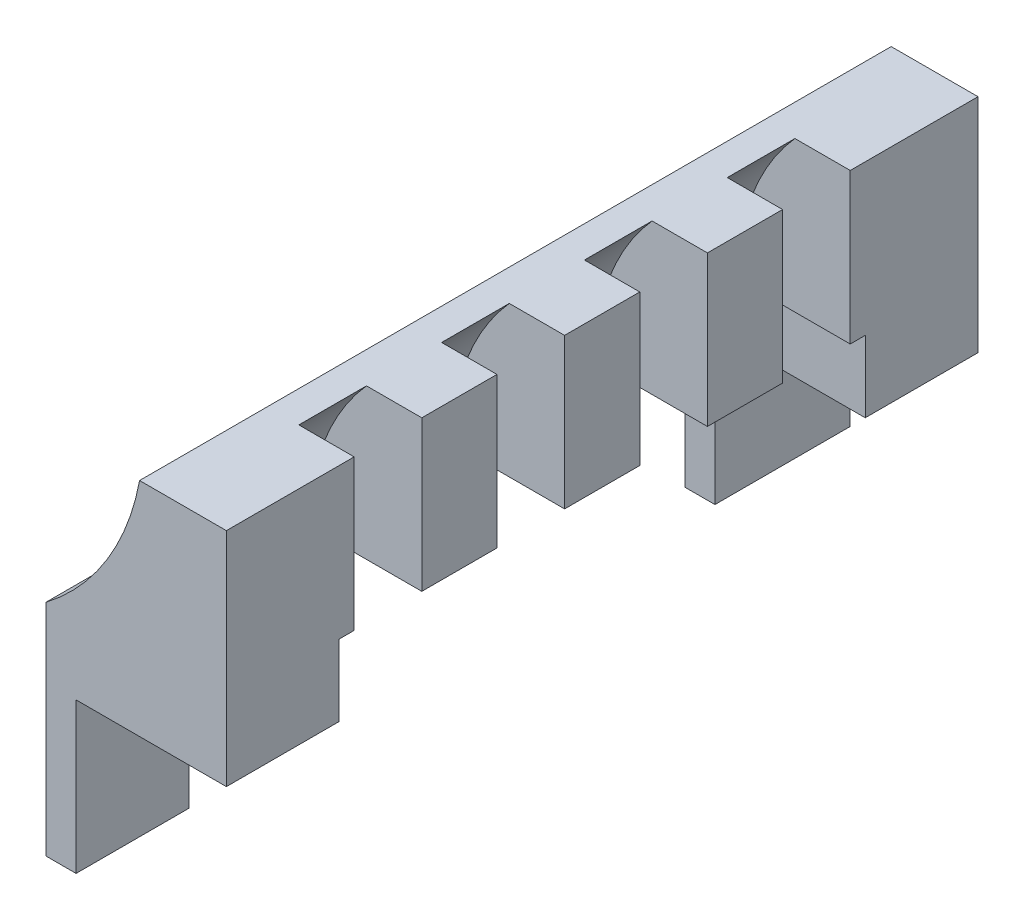
ISO-10303-21;
HEADER;
FILE_DESCRIPTION(('STEP AP214'),'2;1');
FILE_NAME('part.step','',(''),(''),'','','');
FILE_SCHEMA(('AUTOMOTIVE_DESIGN { 1 0 10303 214 1 1 1 1 }'));
ENDSEC;
DATA;
#1=APPLICATION_CONTEXT('core data for automotive mechanical design processes');
#2=APPLICATION_PROTOCOL_DEFINITION('international standard','automotive_design',2000,#1);
#3=PRODUCT_CONTEXT('',#1,'mechanical');
#4=PRODUCT('Part','Part','',(#3));
#5=PRODUCT_RELATED_PRODUCT_CATEGORY('part','',(#4));
#6=PRODUCT_DEFINITION_FORMATION('','',#4);
#7=PRODUCT_DEFINITION_CONTEXT('part definition',#1,'design');
#8=PRODUCT_DEFINITION('design','',#6,#7);
#9=PRODUCT_DEFINITION_SHAPE('','',#8);
#10=(LENGTH_UNIT() NAMED_UNIT(*) SI_UNIT(.MILLI.,.METRE.));
#11=(NAMED_UNIT(*) PLANE_ANGLE_UNIT() SI_UNIT($,.RADIAN.));
#12=(NAMED_UNIT(*) SI_UNIT($,.STERADIAN.) SOLID_ANGLE_UNIT());
#13=UNCERTAINTY_MEASURE_WITH_UNIT(LENGTH_MEASURE(1.E-05),#10,'distance_accuracy_value','');
#14=(GEOMETRIC_REPRESENTATION_CONTEXT(3) GLOBAL_UNCERTAINTY_ASSIGNED_CONTEXT((#13)) GLOBAL_UNIT_ASSIGNED_CONTEXT((#10,
#11,#12)) REPRESENTATION_CONTEXT('',''));
#15=CARTESIAN_POINT('',(0.,0.,0.));
#16=DIRECTION('',(0.,0.,1.));
#17=DIRECTION('',(1.,0.,0.));
#18=AXIS2_PLACEMENT_3D('',#15,#16,#17);
#19=CARTESIAN_POINT('',(-22.,40.75,-50.));
#20=DIRECTION('',(0.,0.,1.));
#21=DIRECTION('',(1.,0.,0.));
#22=AXIS2_PLACEMENT_3D('',#19,#20,#21);
#23=PLANE('',#22);
#24=DIRECTION('',(0.,-1.,0.));
#25=VECTOR('',#24,1.);
#26=CARTESIAN_POINT('',(12.,0.250000000000003,-50.));
#27=LINE('',#26,#25);
#28=CARTESIAN_POINT('',(12.,14.5011905031866,-50.));
#29=VERTEX_POINT('',#28);
#30=CARTESIAN_POINT('',(12.,5.25,-50.));
#31=VERTEX_POINT('',#30);
#32=EDGE_CURVE('E292',#29,#31,#27,.T.);
#33=ORIENTED_EDGE('',*,*,#32,.F.);
#34=DIRECTION('',(1.,0.,0.));
#35=VECTOR('',#34,1.);
#36=CARTESIAN_POINT('',(12.,14.5011905031866,-50.));
#37=LINE('',#36,#35);
#38=CARTESIAN_POINT('',(-2.00000000000001,14.5011905031866,-50.));
#39=VERTEX_POINT('',#38);
#40=EDGE_CURVE('E302',#39,#29,#37,.T.);
#41=ORIENTED_EDGE('',*,*,#40,.F.);
#42=CARTESIAN_POINT('',(-22.,40.75,-50.));
#43=DIRECTION('',(0.,0.,-1.));
#44=DIRECTION('',(1.,0.,0.));
#45=AXIS2_PLACEMENT_3D('',#42,#43,#44);
#46=CIRCLE('',#45,33.);
#47=CARTESIAN_POINT('',(10.4499614791759,34.75,-50.));
#48=VERTEX_POINT('',#47);
#49=EDGE_CURVE('E461',#48,#39,#46,.T.);
#50=ORIENTED_EDGE('',*,*,#49,.F.);
#51=DIRECTION('',(-1.,0.,0.));
#52=VECTOR('',#51,1.);
#53=CARTESIAN_POINT('',(10.4499614791759,34.75,-50.));
#54=LINE('',#53,#52);
#55=CARTESIAN_POINT('',(22.,34.75,-50.));
#56=VERTEX_POINT('',#55);
#57=EDGE_CURVE('E459',#56,#48,#54,.T.);
#58=ORIENTED_EDGE('',*,*,#57,.F.);
#59=DIRECTION('',(0.,1.,0.));
#60=VECTOR('',#59,1.);
#61=CARTESIAN_POINT('',(22.,14.75,-50.));
#62=LINE('',#61,#60);
#63=CARTESIAN_POINT('',(22.,5.25,-50.));
#64=VERTEX_POINT('',#63);
#65=EDGE_CURVE('E457',#64,#56,#62,.T.);
#66=ORIENTED_EDGE('',*,*,#65,.F.);
#67=DIRECTION('',(1.,0.,0.));
#68=VECTOR('',#67,1.);
#69=CARTESIAN_POINT('',(22.,5.25,-50.));
#70=LINE('',#69,#68);
#71=EDGE_CURVE('E64',#31,#64,#70,.T.);
#72=ORIENTED_EDGE('',*,*,#71,.F.);
#73=EDGE_LOOP('',(#33,#41,#50,#58,#66,#72));
#74=FACE_BOUND('',#73,.T.);
#75=ADVANCED_FACE('F41',(#74),#23,.F.);
#76=CARTESIAN_POINT('',(22.,34.75,-50.));
#77=DIRECTION('',(1.,0.,0.));
#78=DIRECTION('',(0.,0.,-1.));
#79=AXIS2_PLACEMENT_3D('',#76,#77,#78);
#80=PLANE('',#79);
#81=DIRECTION('',(0.,1.,0.));
#82=VECTOR('',#81,1.);
#83=CARTESIAN_POINT('',(22.,-2.74285568453605,24.));
#84=LINE('',#83,#82);
#85=CARTESIAN_POINT('',(22.,14.75,24.));
#86=VERTEX_POINT('',#85);
#87=CARTESIAN_POINT('',(22.,34.75,24.));
#88=VERTEX_POINT('',#87);
#89=EDGE_CURVE('E344',#86,#88,#84,.T.);
#90=ORIENTED_EDGE('',*,*,#89,.F.);
#91=DIRECTION('',(0.,0.,1.));
#92=VECTOR('',#91,1.);
#93=CARTESIAN_POINT('',(22.,14.75,35.));
#94=LINE('',#93,#92);
#95=CARTESIAN_POINT('',(22.,14.75,14.));
#96=VERTEX_POINT('',#95);
#97=EDGE_CURVE('E521',#96,#86,#94,.T.);
#98=ORIENTED_EDGE('',*,*,#97,.F.);
#99=DIRECTION('',(0.,1.,0.));
#100=VECTOR('',#99,1.);
#101=CARTESIAN_POINT('',(21.9999999999999,-2.74285568453605,14.));
#102=LINE('',#101,#100);
#103=CARTESIAN_POINT('',(21.9999999999999,34.75,14.));
#104=VERTEX_POINT('',#103);
#105=EDGE_CURVE('E363',#96,#104,#102,.T.);
#106=ORIENTED_EDGE('',*,*,#105,.T.);
#107=DIRECTION('',(0.,0.,1.));
#108=VECTOR('',#107,1.);
#109=CARTESIAN_POINT('',(22.,34.75,-50.));
#110=LINE('',#109,#108);
#111=EDGE_CURVE('E534',#104,#88,#110,.T.);
#112=ORIENTED_EDGE('',*,*,#111,.T.);
#113=EDGE_LOOP('',(#90,#98,#106,#112));
#114=FACE_BOUND('',#113,.T.);
#115=ADVANCED_FACE('F577',(#114),#80,.T.);
#116=DIRECTION('',(0.,1.,0.));
#117=VECTOR('',#116,1.);
#118=CARTESIAN_POINT('',(21.9999999999999,-2.74285568453605,4.99999999999999));
#119=LINE('',#118,#117);
#120=CARTESIAN_POINT('',(21.9999999999999,14.75,4.99999999999999));
#121=VERTEX_POINT('',#120);
#122=CARTESIAN_POINT('',(21.9999999999999,34.75,4.99999999999999));
#123=VERTEX_POINT('',#122);
#124=EDGE_CURVE('E367',#121,#123,#119,.T.);
#125=ORIENTED_EDGE('',*,*,#124,.F.);
#126=CARTESIAN_POINT('',(22.,14.75,-5.));
#127=VERTEX_POINT('',#126);
#128=EDGE_CURVE('E570',#127,#121,#94,.T.);
#129=ORIENTED_EDGE('',*,*,#128,.F.);
#130=DIRECTION('',(0.,1.,0.));
#131=VECTOR('',#130,1.);
#132=CARTESIAN_POINT('',(21.9999999999999,-2.74285568453605,-4.99999999999999));
#133=LINE('',#132,#131);
#134=CARTESIAN_POINT('',(21.9999999999999,34.75,-4.99999999999999));
#135=VERTEX_POINT('',#134);
#136=EDGE_CURVE('E379',#127,#135,#133,.T.);
#137=ORIENTED_EDGE('',*,*,#136,.T.);
#138=EDGE_CURVE('E536',#135,#123,#110,.T.);
#139=ORIENTED_EDGE('',*,*,#138,.T.);
#140=EDGE_LOOP('',(#125,#129,#137,#139));
#141=FACE_BOUND('',#140,.T.);
#142=ADVANCED_FACE('F607',(#141),#80,.T.);
#143=DIRECTION('',(0.,1.,0.));
#144=VECTOR('',#143,1.);
#145=CARTESIAN_POINT('',(21.9999999999999,-2.74285568453605,-14.));
#146=LINE('',#145,#144);
#147=CARTESIAN_POINT('',(21.9999999999999,14.75,-14.));
#148=VERTEX_POINT('',#147);
#149=CARTESIAN_POINT('',(21.9999999999999,34.75,-14.));
#150=VERTEX_POINT('',#149);
#151=EDGE_CURVE('E383',#148,#150,#146,.T.);
#152=ORIENTED_EDGE('',*,*,#151,.F.);
#153=CARTESIAN_POINT('',(22.,14.75,-24.));
#154=VERTEX_POINT('',#153);
#155=EDGE_CURVE('E414',#154,#148,#94,.T.);
#156=ORIENTED_EDGE('',*,*,#155,.F.);
#157=DIRECTION('',(0.,1.,0.));
#158=VECTOR('',#157,1.);
#159=CARTESIAN_POINT('',(22.,-2.74285568453605,-24.));
#160=LINE('',#159,#158);
#161=CARTESIAN_POINT('',(22.,34.75,-24.));
#162=VERTEX_POINT('',#161);
#163=EDGE_CURVE('E393',#154,#162,#160,.T.);
#164=ORIENTED_EDGE('',*,*,#163,.T.);
#165=EDGE_CURVE('E476',#162,#150,#110,.T.);
#166=ORIENTED_EDGE('',*,*,#165,.T.);
#167=EDGE_LOOP('',(#152,#156,#164,#166));
#168=FACE_BOUND('',#167,.T.);
#169=ADVANCED_FACE('F548',(#168),#80,.T.);
#170=DIRECTION('',(0.,1.,0.));
#171=VECTOR('',#170,1.);
#172=CARTESIAN_POINT('',(22.,-2.74285568453605,-33.));
#173=LINE('',#172,#171);
#174=CARTESIAN_POINT('',(22.,14.75,-33.));
#175=VERTEX_POINT('',#174);
#176=CARTESIAN_POINT('',(22.,34.75,-33.));
#177=VERTEX_POINT('',#176);
#178=EDGE_CURVE('E397',#175,#177,#173,.T.);
#179=ORIENTED_EDGE('',*,*,#178,.F.);
#180=CARTESIAN_POINT('',(22.,14.75,-35.));
#181=VERTEX_POINT('',#180);
#182=EDGE_CURVE('E410',#181,#175,#94,.T.);
#183=ORIENTED_EDGE('',*,*,#182,.F.);
#184=DIRECTION('',(0.,1.,0.));
#185=VECTOR('',#184,1.);
#186=CARTESIAN_POINT('',(22.,-14.75,-35.));
#187=LINE('',#186,#185);
#188=CARTESIAN_POINT('',(22.,5.25,-35.));
#189=VERTEX_POINT('',#188);
#190=EDGE_CURVE('E406',#189,#181,#187,.T.);
#191=ORIENTED_EDGE('',*,*,#190,.F.);
#192=DIRECTION('',(0.,0.,1.));
#193=VECTOR('',#192,1.);
#194=CARTESIAN_POINT('',(22.,5.25,-50.));
#195=LINE('',#194,#193);
#196=EDGE_CURVE('E478',#64,#189,#195,.T.);
#197=ORIENTED_EDGE('',*,*,#196,.F.);
#198=ORIENTED_EDGE('',*,*,#65,.T.);
#199=EDGE_CURVE('E473',#56,#177,#110,.T.);
#200=ORIENTED_EDGE('',*,*,#199,.T.);
#201=EDGE_LOOP('',(#179,#183,#191,#197,#198,#200));
#202=FACE_BOUND('',#201,.T.);
#203=ADVANCED_FACE('F618',(#202),#80,.T.);
#204=CARTESIAN_POINT('',(-2.,-14.75,-50.));
#205=DIRECTION('',(-1.,0.,0.));
#206=DIRECTION('',(0.,-1.,0.));
#207=AXIS2_PLACEMENT_3D('',#204,#205,#206);
#208=PLANE('',#207);
#209=DIRECTION('',(0.,1.,0.));
#210=VECTOR('',#209,1.);
#211=CARTESIAN_POINT('',(-2.,-14.75,35.));
#212=LINE('',#211,#210);
#213=CARTESIAN_POINT('',(-2.,-14.75,35.));
#214=VERTEX_POINT('',#213);
#215=CARTESIAN_POINT('',(-2.00000000000001,14.5011905031866,35.));
#216=VERTEX_POINT('',#215);
#217=EDGE_CURVE('E431',#214,#216,#212,.T.);
#218=ORIENTED_EDGE('',*,*,#217,.F.);
#219=DIRECTION('',(0.,0.,1.));
#220=VECTOR('',#219,1.);
#221=CARTESIAN_POINT('',(-2.,-14.75,-50.));
#222=LINE('',#221,#220);
#223=CARTESIAN_POINT('',(-2.,-14.75,50.));
#224=VERTEX_POINT('',#223);
#225=EDGE_CURVE('E464',#214,#224,#222,.T.);
#226=ORIENTED_EDGE('',*,*,#225,.T.);
#227=DIRECTION('',(0.,-1.,0.));
#228=VECTOR('',#227,1.);
#229=CARTESIAN_POINT('',(-2.,-14.75,50.));
#230=LINE('',#229,#228);
#231=CARTESIAN_POINT('',(-2.00000000000001,14.5011905031866,50.));
#232=VERTEX_POINT('',#231);
#233=EDGE_CURVE('E435',#232,#224,#230,.T.);
#234=ORIENTED_EDGE('',*,*,#233,.F.);
#235=DIRECTION('',(0.,0.,1.));
#236=VECTOR('',#235,1.);
#237=CARTESIAN_POINT('',(-2.00000000000001,14.5011905031866,-50.));
#238=LINE('',#237,#236);
#239=EDGE_CURVE('E469',#216,#232,#238,.T.);
#240=ORIENTED_EDGE('',*,*,#239,.F.);
#241=EDGE_LOOP('',(#218,#226,#234,#240));
#242=FACE_BOUND('',#241,.T.);
#243=ADVANCED_FACE('F496',(#242),#208,.T.);
#244=CARTESIAN_POINT('',(22.,5.25,-50.));
#245=DIRECTION('',(0.,-1.,0.));
#246=DIRECTION('',(1.,0.,0.));
#247=AXIS2_PLACEMENT_3D('',#244,#245,#246);
#248=PLANE('',#247);
#249=DIRECTION('',(-1.,0.,0.));
#250=VECTOR('',#249,1.);
#251=CARTESIAN_POINT('',(22.,5.25,35.));
#252=LINE('',#251,#250);
#253=CARTESIAN_POINT('',(22.,5.25,35.));
#254=VERTEX_POINT('',#253);
#255=CARTESIAN_POINT('',(2.,5.25,35.));
#256=VERTEX_POINT('',#255);
#257=EDGE_CURVE('E427',#254,#256,#252,.T.);
#258=ORIENTED_EDGE('',*,*,#257,.F.);
#259=CARTESIAN_POINT('',(22.,5.25,50.));
#260=VERTEX_POINT('',#259);
#261=EDGE_CURVE('E481',#254,#260,#195,.T.);
#262=ORIENTED_EDGE('',*,*,#261,.T.);
#263=DIRECTION('',(1.,0.,0.));
#264=VECTOR('',#263,1.);
#265=CARTESIAN_POINT('',(22.,5.25,50.));
#266=LINE('',#265,#264);
#267=CARTESIAN_POINT('',(2.,5.25,50.));
#268=VERTEX_POINT('',#267);
#269=EDGE_CURVE('E444',#268,#260,#266,.T.);
#270=ORIENTED_EDGE('',*,*,#269,.F.);
#271=DIRECTION('',(0.,0.,1.));
#272=VECTOR('',#271,1.);
#273=CARTESIAN_POINT('',(2.,5.25,-50.));
#274=LINE('',#273,#272);
#275=EDGE_CURVE('E274',#256,#268,#274,.T.);
#276=ORIENTED_EDGE('',*,*,#275,.F.);
#277=EDGE_LOOP('',(#258,#262,#270,#276));
#278=FACE_BOUND('',#277,.T.);
#279=ADVANCED_FACE('F528',(#278),#248,.T.);
#280=CARTESIAN_POINT('',(2.,-14.75,-50.));
#281=DIRECTION('',(1.,0.,0.));
#282=DIRECTION('',(0.,0.,-1.));
#283=AXIS2_PLACEMENT_3D('',#280,#281,#282);
#284=PLANE('',#283);
#285=DIRECTION('',(0.,-1.,0.));
#286=VECTOR('',#285,1.);
#287=CARTESIAN_POINT('',(2.,-14.75,35.));
#288=LINE('',#287,#286);
#289=CARTESIAN_POINT('',(2.,-14.75,35.));
#290=VERTEX_POINT('',#289);
#291=EDGE_CURVE('E425',#256,#290,#288,.T.);
#292=ORIENTED_EDGE('',*,*,#291,.F.);
#293=ORIENTED_EDGE('',*,*,#275,.T.);
#294=DIRECTION('',(0.,1.,0.));
#295=VECTOR('',#294,1.);
#296=CARTESIAN_POINT('',(2.,-14.75,50.));
#297=LINE('',#296,#295);
#298=CARTESIAN_POINT('',(2.,-14.75,50.));
#299=VERTEX_POINT('',#298);
#300=EDGE_CURVE('E441',#299,#268,#297,.T.);
#301=ORIENTED_EDGE('',*,*,#300,.F.);
#302=DIRECTION('',(0.,0.,1.));
#303=VECTOR('',#302,1.);
#304=CARTESIAN_POINT('',(2.,-14.75,-50.));
#305=LINE('',#304,#303);
#306=EDGE_CURVE('E275',#290,#299,#305,.T.);
#307=ORIENTED_EDGE('',*,*,#306,.F.);
#308=EDGE_LOOP('',(#292,#293,#301,#307));
#309=FACE_BOUND('',#308,.T.);
#310=ADVANCED_FACE('F531',(#309),#284,.T.);
#311=CARTESIAN_POINT('',(-2.,-14.75,-50.));
#312=DIRECTION('',(0.,-1.,0.));
#313=DIRECTION('',(0.,0.,-1.));
#314=AXIS2_PLACEMENT_3D('',#311,#312,#313);
#315=PLANE('',#314);
#316=DIRECTION('',(-1.,0.,0.));
#317=VECTOR('',#316,1.);
#318=CARTESIAN_POINT('',(-2.,-14.75,35.));
#319=LINE('',#318,#317);
#320=EDGE_CURVE('E49',#290,#214,#319,.T.);
#321=ORIENTED_EDGE('',*,*,#320,.F.);
#322=ORIENTED_EDGE('',*,*,#306,.T.);
#323=DIRECTION('',(1.,0.,0.));
#324=VECTOR('',#323,1.);
#325=CARTESIAN_POINT('',(-2.,-14.75,50.));
#326=LINE('',#325,#324);
#327=EDGE_CURVE('E438',#224,#299,#326,.T.);
#328=ORIENTED_EDGE('',*,*,#327,.F.);
#329=ORIENTED_EDGE('',*,*,#225,.F.);
#330=EDGE_LOOP('',(#321,#322,#328,#329));
#331=FACE_BOUND('',#330,.T.);
#332=ADVANCED_FACE('F500',(#331),#315,.T.);
#333=DIRECTION('',(0.,-1.,0.));
#334=VECTOR('',#333,1.);
#335=CARTESIAN_POINT('',(-2.,-14.75,-35.));
#336=LINE('',#335,#334);
#337=CARTESIAN_POINT('',(-2.00000000000001,14.5011905031866,-35.));
#338=VERTEX_POINT('',#337);
#339=CARTESIAN_POINT('',(-2.,-14.75,-35.));
#340=VERTEX_POINT('',#339);
#341=EDGE_CURVE('E423',#338,#340,#336,.T.);
#342=ORIENTED_EDGE('',*,*,#341,.F.);
#343=EDGE_CURVE('E465',#39,#338,#238,.T.);
#344=ORIENTED_EDGE('',*,*,#343,.F.);
#345=DIRECTION('',(0.,0.,1.));
#346=VECTOR('',#345,1.);
#347=CARTESIAN_POINT('',(-2.,14.5011905031866,-53.));
#348=LINE('',#347,#346);
#349=CARTESIAN_POINT('',(-2.,14.5011905031866,-53.));
#350=VERTEX_POINT('',#349);
#351=EDGE_CURVE('E315',#350,#39,#348,.T.);
#352=ORIENTED_EDGE('',*,*,#351,.F.);
#353=DIRECTION('',(0.,1.,0.));
#354=VECTOR('',#353,1.);
#355=CARTESIAN_POINT('',(-2.,-14.75,-53.));
#356=LINE('',#355,#354);
#357=CARTESIAN_POINT('',(-2.,-14.75,-53.));
#358=VERTEX_POINT('',#357);
#359=EDGE_CURVE('E284',#358,#350,#356,.T.);
#360=ORIENTED_EDGE('',*,*,#359,.F.);
#361=EDGE_CURVE('E281',#358,#340,#222,.T.);
#362=ORIENTED_EDGE('',*,*,#361,.T.);
#363=EDGE_LOOP('',(#342,#344,#352,#360,#362));
#364=FACE_BOUND('',#363,.T.);
#365=ADVANCED_FACE('F43',(#364),#208,.T.);
#366=CARTESIAN_POINT('',(-22.,40.75,-50.));
#367=DIRECTION('',(0.,0.,1.));
#368=DIRECTION('',(1.,0.,0.));
#369=AXIS2_PLACEMENT_3D('',#366,#367,#368);
#370=CYLINDRICAL_SURFACE('',#369,33.);
#371=ORIENTED_EDGE('',*,*,#239,.T.);
#372=CARTESIAN_POINT('',(-22.,40.75,50.));
#373=DIRECTION('',(0.,0.,-1.));
#374=DIRECTION('',(1.,0.,0.));
#375=AXIS2_PLACEMENT_3D('',#372,#373,#374);
#376=CIRCLE('',#375,33.);
#377=CARTESIAN_POINT('',(10.4499614791759,34.75,50.));
#378=VERTEX_POINT('',#377);
#379=EDGE_CURVE('E452',#378,#232,#376,.T.);
#380=ORIENTED_EDGE('',*,*,#379,.F.);
#381=DIRECTION('',(0.,0.,1.));
#382=VECTOR('',#381,1.);
#383=CARTESIAN_POINT('',(10.4499614791759,34.75,-50.));
#384=LINE('',#383,#382);
#385=EDGE_CURVE('E470',#48,#378,#384,.T.);
#386=ORIENTED_EDGE('',*,*,#385,.F.);
#387=ORIENTED_EDGE('',*,*,#49,.T.);
#388=ORIENTED_EDGE('',*,*,#343,.T.);
#389=CARTESIAN_POINT('',(-22.,40.75,-35.));
#390=DIRECTION('',(0.,0.,-1.));
#391=DIRECTION('',(-1.,0.,0.));
#392=AXIS2_PLACEMENT_3D('',#389,#390,#391);
#393=CIRCLE('',#392,33.);
#394=CARTESIAN_POINT('',(-1.67759856709843,14.75,-35.));
#395=VERTEX_POINT('',#394);
#396=EDGE_CURVE('E421',#395,#338,#393,.T.);
#397=ORIENTED_EDGE('',*,*,#396,.F.);
#398=DIRECTION('',(0.,0.,1.));
#399=VECTOR('',#398,1.);
#400=CARTESIAN_POINT('',(-1.67759856709843,14.75,-50.));
#401=LINE('',#400,#399);
#402=CARTESIAN_POINT('',(-1.67759856709843,14.75,35.));
#403=VERTEX_POINT('',#402);
#404=EDGE_CURVE('E433',#403,#395,#401,.F.);
#405=ORIENTED_EDGE('',*,*,#404,.F.);
#406=CARTESIAN_POINT('',(-22.,40.75,35.));
#407=DIRECTION('',(0.,0.,1.));
#408=DIRECTION('',(1.,0.,0.));
#409=AXIS2_PLACEMENT_3D('',#406,#407,#408);
#410=CIRCLE('',#409,33.);
#411=EDGE_CURVE('E429',#216,#403,#410,.T.);
#412=ORIENTED_EDGE('',*,*,#411,.F.);
#413=EDGE_LOOP('',(#371,#380,#386,#387,#388,#397,#405,#412));
#414=FACE_BOUND('',#413,.T.);
#415=ADVANCED_FACE('F508',(#414),#370,.F.);
#416=CARTESIAN_POINT('',(10.4499614791759,34.75,-50.));
#417=DIRECTION('',(0.,1.,0.));
#418=DIRECTION('',(0.,0.,1.));
#419=AXIS2_PLACEMENT_3D('',#416,#417,#418);
#420=PLANE('',#419);
#421=DIRECTION('',(1.,0.,0.));
#422=VECTOR('',#421,1.);
#423=CARTESIAN_POINT('',(6.99999999999987,34.75,33.));
#424=LINE('',#423,#422);
#425=CARTESIAN_POINT('',(14.6393202250021,34.75,33.));
#426=VERTEX_POINT('',#425);
#427=CARTESIAN_POINT('',(22.,34.75,33.));
#428=VERTEX_POINT('',#427);
#429=EDGE_CURVE('E348',#426,#428,#424,.T.);
#430=ORIENTED_EDGE('',*,*,#429,.F.);
#431=DIRECTION('',(0.,0.,1.));
#432=VECTOR('',#431,1.);
#433=CARTESIAN_POINT('',(14.6393202250021,34.75,-71.4093253863854));
#434=LINE('',#433,#432);
#435=CARTESIAN_POINT('',(14.6393202250021,34.75,24.));
#436=VERTEX_POINT('',#435);
#437=EDGE_CURVE('E318',#436,#426,#434,.T.);
#438=ORIENTED_EDGE('',*,*,#437,.F.);
#439=DIRECTION('',(-1.,0.,0.));
#440=VECTOR('',#439,1.);
#441=CARTESIAN_POINT('',(6.99999999999987,34.75,24.));
#442=LINE('',#441,#440);
#443=EDGE_CURVE('E350',#88,#436,#442,.T.);
#444=ORIENTED_EDGE('',*,*,#443,.F.);
#445=ORIENTED_EDGE('',*,*,#111,.F.);
#446=DIRECTION('',(1.,0.,0.));
#447=VECTOR('',#446,1.);
#448=CARTESIAN_POINT('',(6.99999999999978,34.75,14.));
#449=LINE('',#448,#447);
#450=CARTESIAN_POINT('',(14.6393202250021,34.75,14.));
#451=VERTEX_POINT('',#450);
#452=EDGE_CURVE('E351',#451,#104,#449,.T.);
#453=ORIENTED_EDGE('',*,*,#452,.F.);
#454=CARTESIAN_POINT('',(14.6393202250021,34.75,5.));
#455=VERTEX_POINT('',#454);
#456=EDGE_CURVE('E321',#455,#451,#434,.T.);
#457=ORIENTED_EDGE('',*,*,#456,.F.);
#458=DIRECTION('',(-1.,0.,0.));
#459=VECTOR('',#458,1.);
#460=CARTESIAN_POINT('',(7.00000000000003,34.75,5.));
#461=LINE('',#460,#459);
#462=EDGE_CURVE('E366',#123,#455,#461,.T.);
#463=ORIENTED_EDGE('',*,*,#462,.F.);
#464=ORIENTED_EDGE('',*,*,#138,.F.);
#465=DIRECTION('',(1.,0.,0.));
#466=VECTOR('',#465,1.);
#467=CARTESIAN_POINT('',(7.00000000000002,34.75,-5.));
#468=LINE('',#467,#466);
#469=CARTESIAN_POINT('',(14.6393202250021,34.75,-4.99999999999999));
#470=VERTEX_POINT('',#469);
#471=EDGE_CURVE('E362',#470,#135,#468,.T.);
#472=ORIENTED_EDGE('',*,*,#471,.F.);
#473=CARTESIAN_POINT('',(14.6393202250021,34.75,-14.));
#474=VERTEX_POINT('',#473);
#475=EDGE_CURVE('E556',#474,#470,#434,.T.);
#476=ORIENTED_EDGE('',*,*,#475,.F.);
#477=DIRECTION('',(-1.,0.,0.));
#478=VECTOR('',#477,1.);
#479=CARTESIAN_POINT('',(6.99999999999978,34.75,-14.));
#480=LINE('',#479,#478);
#481=EDGE_CURVE('E382',#150,#474,#480,.T.);
#482=ORIENTED_EDGE('',*,*,#481,.F.);
#483=ORIENTED_EDGE('',*,*,#165,.F.);
#484=DIRECTION('',(1.,0.,0.));
#485=VECTOR('',#484,1.);
#486=CARTESIAN_POINT('',(6.99999999999987,34.75,-24.));
#487=LINE('',#486,#485);
#488=CARTESIAN_POINT('',(14.6393202250021,34.75,-24.));
#489=VERTEX_POINT('',#488);
#490=EDGE_CURVE('E378',#489,#162,#487,.T.);
#491=ORIENTED_EDGE('',*,*,#490,.F.);
#492=CARTESIAN_POINT('',(14.6393202250021,34.75,-33.));
#493=VERTEX_POINT('',#492);
#494=EDGE_CURVE('E322',#493,#489,#434,.T.);
#495=ORIENTED_EDGE('',*,*,#494,.F.);
#496=DIRECTION('',(-1.,0.,0.));
#497=VECTOR('',#496,1.);
#498=CARTESIAN_POINT('',(6.99999999999987,34.75,-33.));
#499=LINE('',#498,#497);
#500=EDGE_CURVE('E396',#177,#493,#499,.T.);
#501=ORIENTED_EDGE('',*,*,#500,.F.);
#502=ORIENTED_EDGE('',*,*,#199,.F.);
#503=ORIENTED_EDGE('',*,*,#57,.T.);
#504=ORIENTED_EDGE('',*,*,#385,.T.);
#505=DIRECTION('',(-1.,0.,0.));
#506=VECTOR('',#505,1.);
#507=CARTESIAN_POINT('',(10.4499614791759,34.75,50.));
#508=LINE('',#507,#506);
#509=CARTESIAN_POINT('',(22.,34.75,50.));
#510=VERTEX_POINT('',#509);
#511=EDGE_CURVE('E450',#510,#378,#508,.T.);
#512=ORIENTED_EDGE('',*,*,#511,.F.);
#513=EDGE_CURVE('E477',#428,#510,#110,.T.);
#514=ORIENTED_EDGE('',*,*,#513,.F.);
#515=EDGE_LOOP('',(#430,#438,#444,#445,#453,#457,#463,#464,#472,#476,#482,#483,#491,#495,#501,
#502,#503,#504,#512,#514));
#516=FACE_BOUND('',#515,.T.);
#517=ADVANCED_FACE('F552',(#516),#420,.T.);
#518=DIRECTION('',(0.,1.,0.));
#519=VECTOR('',#518,1.);
#520=CARTESIAN_POINT('',(22.,-2.74285568453605,33.));
#521=LINE('',#520,#519);
#522=CARTESIAN_POINT('',(22.,14.75,33.));
#523=VERTEX_POINT('',#522);
#524=EDGE_CURVE('E353',#523,#428,#521,.T.);
#525=ORIENTED_EDGE('',*,*,#524,.T.);
#526=ORIENTED_EDGE('',*,*,#513,.T.);
#527=DIRECTION('',(0.,1.,0.));
#528=VECTOR('',#527,1.);
#529=CARTESIAN_POINT('',(22.,14.75,50.));
#530=LINE('',#529,#528);
#531=EDGE_CURVE('E447',#260,#510,#530,.T.);
#532=ORIENTED_EDGE('',*,*,#531,.F.);
#533=ORIENTED_EDGE('',*,*,#261,.F.);
#534=DIRECTION('',(0.,-1.,0.));
#535=VECTOR('',#534,1.);
#536=CARTESIAN_POINT('',(22.,-14.75,35.));
#537=LINE('',#536,#535);
#538=CARTESIAN_POINT('',(22.,14.75,35.));
#539=VERTEX_POINT('',#538);
#540=EDGE_CURVE('E358',#539,#254,#537,.T.);
#541=ORIENTED_EDGE('',*,*,#540,.F.);
#542=EDGE_CURVE('E409',#523,#539,#94,.T.);
#543=ORIENTED_EDGE('',*,*,#542,.F.);
#544=EDGE_LOOP('',(#525,#526,#532,#533,#541,#543));
#545=FACE_BOUND('',#544,.T.);
#546=ADVANCED_FACE('F523',(#545),#80,.T.);
#547=DIRECTION('',(1.,0.,0.));
#548=VECTOR('',#547,1.);
#549=CARTESIAN_POINT('',(22.,5.25,-35.));
#550=LINE('',#549,#548);
#551=CARTESIAN_POINT('',(2.,5.25,-35.));
#552=VERTEX_POINT('',#551);
#553=EDGE_CURVE('E419',#552,#189,#550,.T.);
#554=ORIENTED_EDGE('',*,*,#553,.F.);
#555=CARTESIAN_POINT('',(2.,5.25,-50.));
#556=VERTEX_POINT('',#555);
#557=EDGE_CURVE('E482',#556,#552,#274,.T.);
#558=ORIENTED_EDGE('',*,*,#557,.F.);
#559=EDGE_CURVE('E455',#556,#31,#70,.T.);
#560=ORIENTED_EDGE('',*,*,#559,.T.);
#561=ORIENTED_EDGE('',*,*,#71,.T.);
#562=ORIENTED_EDGE('',*,*,#196,.T.);
#563=EDGE_LOOP('',(#554,#558,#560,#561,#562));
#564=FACE_BOUND('',#563,.T.);
#565=ADVANCED_FACE('F617',(#564),#248,.T.);
#566=DIRECTION('',(0.,1.,0.));
#567=VECTOR('',#566,1.);
#568=CARTESIAN_POINT('',(2.,-14.75,-35.));
#569=LINE('',#568,#567);
#570=CARTESIAN_POINT('',(2.,-14.75,-35.));
#571=VERTEX_POINT('',#570);
#572=EDGE_CURVE('E271',#571,#552,#569,.T.);
#573=ORIENTED_EDGE('',*,*,#572,.F.);
#574=CARTESIAN_POINT('',(2.,-14.75,-53.));
#575=VERTEX_POINT('',#574);
#576=EDGE_CURVE('E264',#575,#571,#305,.T.);
#577=ORIENTED_EDGE('',*,*,#576,.F.);
#578=DIRECTION('',(0.,-1.,0.));
#579=VECTOR('',#578,1.);
#580=CARTESIAN_POINT('',(2.,0.250000000000003,-53.));
#581=LINE('',#580,#579);
#582=CARTESIAN_POINT('',(2.,0.250000000000003,-53.));
#583=VERTEX_POINT('',#582);
#584=EDGE_CURVE('E269',#583,#575,#581,.T.);
#585=ORIENTED_EDGE('',*,*,#584,.F.);
#586=DIRECTION('',(0.,0.,1.));
#587=VECTOR('',#586,1.);
#588=CARTESIAN_POINT('',(2.,0.250000000000003,-53.));
#589=LINE('',#588,#587);
#590=CARTESIAN_POINT('',(2.,0.250000000000004,-50.));
#591=VERTEX_POINT('',#590);
#592=EDGE_CURVE('E301',#583,#591,#589,.T.);
#593=ORIENTED_EDGE('',*,*,#592,.T.);
#594=DIRECTION('',(0.,1.,0.));
#595=VECTOR('',#594,1.);
#596=CARTESIAN_POINT('',(2.,-14.75,-50.));
#597=LINE('',#596,#595);
#598=EDGE_CURVE('E56',#591,#556,#597,.T.);
#599=ORIENTED_EDGE('',*,*,#598,.T.);
#600=ORIENTED_EDGE('',*,*,#557,.T.);
#601=EDGE_LOOP('',(#573,#577,#585,#593,#599,#600));
#602=FACE_BOUND('',#601,.T.);
#603=ADVANCED_FACE('F266',(#602),#284,.T.);
#604=DIRECTION('',(1.,0.,0.));
#605=VECTOR('',#604,1.);
#606=CARTESIAN_POINT('',(-2.,-14.75,-35.));
#607=LINE('',#606,#605);
#608=EDGE_CURVE('E468',#340,#571,#607,.T.);
#609=ORIENTED_EDGE('',*,*,#608,.F.);
#610=ORIENTED_EDGE('',*,*,#361,.F.);
#611=DIRECTION('',(-1.,0.,0.));
#612=VECTOR('',#611,1.);
#613=CARTESIAN_POINT('',(2.,-14.75,-53.));
#614=LINE('',#613,#612);
#615=EDGE_CURVE('E278',#575,#358,#614,.T.);
#616=ORIENTED_EDGE('',*,*,#615,.F.);
#617=ORIENTED_EDGE('',*,*,#576,.T.);
#618=EDGE_LOOP('',(#609,#610,#616,#617));
#619=FACE_BOUND('',#618,.T.);
#620=ADVANCED_FACE('F279',(#619),#315,.T.);
#621=CARTESIAN_POINT('',(-22.,40.75,50.));
#622=DIRECTION('',(0.,0.,1.));
#623=DIRECTION('',(1.,0.,0.));
#624=AXIS2_PLACEMENT_3D('',#621,#622,#623);
#625=PLANE('',#624);
#626=ORIENTED_EDGE('',*,*,#511,.T.);
#627=ORIENTED_EDGE('',*,*,#379,.T.);
#628=ORIENTED_EDGE('',*,*,#233,.T.);
#629=ORIENTED_EDGE('',*,*,#327,.T.);
#630=ORIENTED_EDGE('',*,*,#300,.T.);
#631=ORIENTED_EDGE('',*,*,#269,.T.);
#632=ORIENTED_EDGE('',*,*,#531,.T.);
#633=EDGE_LOOP('',(#626,#627,#628,#629,#630,#631,#632));
#634=FACE_BOUND('',#633,.T.);
#635=ADVANCED_FACE('F503',(#634),#625,.T.);
#636=CARTESIAN_POINT('',(-2.000012,-14.75,35.));
#637=DIRECTION('',(0.,0.,1.));
#638=DIRECTION('',(1.,0.,0.));
#639=AXIS2_PLACEMENT_3D('',#636,#637,#638);
#640=PLANE('',#639);
#641=ORIENTED_EDGE('',*,*,#217,.T.);
#642=ORIENTED_EDGE('',*,*,#411,.T.);
#643=DIRECTION('',(1.,0.,0.));
#644=VECTOR('',#643,1.);
#645=CARTESIAN_POINT('',(-2.000012,14.75,35.));
#646=LINE('',#645,#644);
#647=EDGE_CURVE('E415',#403,#539,#646,.T.);
#648=ORIENTED_EDGE('',*,*,#647,.T.);
#649=ORIENTED_EDGE('',*,*,#540,.T.);
#650=ORIENTED_EDGE('',*,*,#257,.T.);
#651=ORIENTED_EDGE('',*,*,#291,.T.);
#652=ORIENTED_EDGE('',*,*,#320,.T.);
#653=EDGE_LOOP('',(#641,#642,#648,#649,#650,#651,#652));
#654=FACE_BOUND('',#653,.T.);
#655=ADVANCED_FACE('F488',(#654),#640,.F.);
#656=CARTESIAN_POINT('',(-2.000012,14.75,35.));
#657=DIRECTION('',(0.,1.,0.));
#658=DIRECTION('',(-1.,0.,0.));
#659=AXIS2_PLACEMENT_3D('',#656,#657,#658);
#660=PLANE('',#659);
#661=DIRECTION('',(1.,0.,0.));
#662=VECTOR('',#661,1.);
#663=CARTESIAN_POINT('',(-2.000012,14.75,-35.));
#664=LINE('',#663,#662);
#665=EDGE_CURVE('E413',#395,#181,#664,.T.);
#666=ORIENTED_EDGE('',*,*,#665,.T.);
#667=ORIENTED_EDGE('',*,*,#182,.T.);
#668=DIRECTION('',(1.,0.,0.));
#669=VECTOR('',#668,1.);
#670=CARTESIAN_POINT('',(6.99999999999987,14.75,-33.));
#671=LINE('',#670,#669);
#672=CARTESIAN_POINT('',(6.99999999999987,14.75,-33.));
#673=VERTEX_POINT('',#672);
#674=EDGE_CURVE('E399',#673,#175,#671,.T.);
#675=ORIENTED_EDGE('',*,*,#674,.F.);
#676=DIRECTION('',(0.,0.,-1.));
#677=VECTOR('',#676,1.);
#678=CARTESIAN_POINT('',(6.99999999999987,14.75,-33.));
#679=LINE('',#678,#677);
#680=CARTESIAN_POINT('',(6.99999999999987,14.75,-24.));
#681=VERTEX_POINT('',#680);
#682=EDGE_CURVE('E392',#681,#673,#679,.T.);
#683=ORIENTED_EDGE('',*,*,#682,.F.);
#684=DIRECTION('',(-1.,0.,0.));
#685=VECTOR('',#684,1.);
#686=CARTESIAN_POINT('',(6.99999999999987,14.75,-24.));
#687=LINE('',#686,#685);
#688=EDGE_CURVE('E340',#154,#681,#687,.T.);
#689=ORIENTED_EDGE('',*,*,#688,.F.);
#690=ORIENTED_EDGE('',*,*,#155,.T.);
#691=DIRECTION('',(1.,0.,0.));
#692=VECTOR('',#691,1.);
#693=CARTESIAN_POINT('',(6.99999999999978,14.75,-14.));
#694=LINE('',#693,#692);
#695=CARTESIAN_POINT('',(6.99999999999978,14.75,-14.));
#696=VERTEX_POINT('',#695);
#697=EDGE_CURVE('E385',#696,#148,#694,.T.);
#698=ORIENTED_EDGE('',*,*,#697,.F.);
#699=DIRECTION('',(0.,0.,-1.));
#700=VECTOR('',#699,1.);
#701=CARTESIAN_POINT('',(6.99999999999978,14.75,-14.));
#702=LINE('',#701,#700);
#703=CARTESIAN_POINT('',(7.00000000000002,14.75,-5.));
#704=VERTEX_POINT('',#703);
#705=EDGE_CURVE('E377',#704,#696,#702,.T.);
#706=ORIENTED_EDGE('',*,*,#705,.F.);
#707=DIRECTION('',(-1.,0.,0.));
#708=VECTOR('',#707,1.);
#709=CARTESIAN_POINT('',(7.00000000000002,14.75,-5.));
#710=LINE('',#709,#708);
#711=EDGE_CURVE('E375',#127,#704,#710,.T.);
#712=ORIENTED_EDGE('',*,*,#711,.F.);
#713=ORIENTED_EDGE('',*,*,#128,.T.);
#714=DIRECTION('',(1.,0.,0.));
#715=VECTOR('',#714,1.);
#716=CARTESIAN_POINT('',(7.00000000000003,14.75,5.));
#717=LINE('',#716,#715);
#718=CARTESIAN_POINT('',(7.00000000000003,14.75,5.));
#719=VERTEX_POINT('',#718);
#720=EDGE_CURVE('E369',#719,#121,#717,.T.);
#721=ORIENTED_EDGE('',*,*,#720,.F.);
#722=DIRECTION('',(0.,0.,-1.));
#723=VECTOR('',#722,1.);
#724=CARTESIAN_POINT('',(7.00000000000003,14.75,5.));
#725=LINE('',#724,#723);
#726=CARTESIAN_POINT('',(6.99999999999978,14.75,14.));
#727=VERTEX_POINT('',#726);
#728=EDGE_CURVE('E361',#727,#719,#725,.T.);
#729=ORIENTED_EDGE('',*,*,#728,.F.);
#730=DIRECTION('',(-1.,0.,0.));
#731=VECTOR('',#730,1.);
#732=CARTESIAN_POINT('',(6.99999999999978,14.75,14.));
#733=LINE('',#732,#731);
#734=EDGE_CURVE('E359',#96,#727,#733,.T.);
#735=ORIENTED_EDGE('',*,*,#734,.F.);
#736=ORIENTED_EDGE('',*,*,#97,.T.);
#737=DIRECTION('',(1.,0.,0.));
#738=VECTOR('',#737,1.);
#739=CARTESIAN_POINT('',(6.99999999999987,14.75,24.));
#740=LINE('',#739,#738);
#741=CARTESIAN_POINT('',(6.99999999999987,14.75,24.));
#742=VERTEX_POINT('',#741);
#743=EDGE_CURVE('E341',#742,#86,#740,.T.);
#744=ORIENTED_EDGE('',*,*,#743,.F.);
#745=DIRECTION('',(0.,0.,-1.));
#746=VECTOR('',#745,1.);
#747=CARTESIAN_POINT('',(6.99999999999987,14.75,24.));
#748=LINE('',#747,#746);
#749=CARTESIAN_POINT('',(6.99999999999987,14.75,33.));
#750=VERTEX_POINT('',#749);
#751=EDGE_CURVE('E343',#750,#742,#748,.T.);
#752=ORIENTED_EDGE('',*,*,#751,.F.);
#753=DIRECTION('',(-1.,0.,0.));
#754=VECTOR('',#753,1.);
#755=CARTESIAN_POINT('',(6.99999999999987,14.75,33.));
#756=LINE('',#755,#754);
#757=EDGE_CURVE('E347',#523,#750,#756,.T.);
#758=ORIENTED_EDGE('',*,*,#757,.F.);
#759=ORIENTED_EDGE('',*,*,#542,.T.);
#760=ORIENTED_EDGE('',*,*,#647,.F.);
#761=ORIENTED_EDGE('',*,*,#404,.T.);
#762=EDGE_LOOP('',(#666,#667,#675,#683,#689,#690,#698,#706,#712,#713,#721,#729,#735,#736,#744,
#752,#758,#759,#760,#761));
#763=FACE_BOUND('',#762,.T.);
#764=ADVANCED_FACE('F514',(#763),#660,.F.);
#765=CARTESIAN_POINT('',(-2.000012,-14.75,-35.));
#766=DIRECTION('',(0.,0.,-1.));
#767=DIRECTION('',(-1.,0.,0.));
#768=AXIS2_PLACEMENT_3D('',#765,#766,#767);
#769=PLANE('',#768);
#770=ORIENTED_EDGE('',*,*,#341,.T.);
#771=ORIENTED_EDGE('',*,*,#608,.T.);
#772=ORIENTED_EDGE('',*,*,#572,.T.);
#773=ORIENTED_EDGE('',*,*,#553,.T.);
#774=ORIENTED_EDGE('',*,*,#190,.T.);
#775=ORIENTED_EDGE('',*,*,#665,.F.);
#776=ORIENTED_EDGE('',*,*,#396,.T.);
#777=EDGE_LOOP('',(#770,#771,#772,#773,#774,#775,#776));
#778=FACE_BOUND('',#777,.T.);
#779=ADVANCED_FACE('F654',(#778),#769,.F.);
#780=CARTESIAN_POINT('',(6.99999999999987,-2.74285568453605,-33.));
#781=DIRECTION('',(0.,0.,-1.));
#782=DIRECTION('',(-1.,0.,0.));
#783=AXIS2_PLACEMENT_3D('',#780,#781,#782);
#784=PLANE('',#783);
#785=ORIENTED_EDGE('',*,*,#500,.T.);
#786=CARTESIAN_POINT('',(37.,14.75,-33.));
#787=DIRECTION('',(0.,0.,-1.));
#788=DIRECTION('',(-1.,0.,0.));
#789=AXIS2_PLACEMENT_3D('',#786,#787,#788);
#790=CIRCLE('',#789,30.);
#791=EDGE_CURVE('E338',#493,#673,#790,.F.);
#792=ORIENTED_EDGE('',*,*,#791,.T.);
#793=ORIENTED_EDGE('',*,*,#674,.T.);
#794=ORIENTED_EDGE('',*,*,#178,.T.);
#795=EDGE_LOOP('',(#785,#792,#793,#794));
#796=FACE_BOUND('',#795,.T.);
#797=ADVANCED_FACE('F675',(#796),#784,.F.);
#798=CARTESIAN_POINT('',(6.99999999999987,-2.74285568453605,-24.));
#799=DIRECTION('',(0.,0.,1.));
#800=DIRECTION('',(1.,0.,0.));
#801=AXIS2_PLACEMENT_3D('',#798,#799,#800);
#802=PLANE('',#801);
#803=ORIENTED_EDGE('',*,*,#688,.T.);
#804=CARTESIAN_POINT('',(37.,14.75,-24.));
#805=DIRECTION('',(0.,0.,1.));
#806=DIRECTION('',(1.,0.,0.));
#807=AXIS2_PLACEMENT_3D('',#804,#805,#806);
#808=CIRCLE('',#807,30.);
#809=EDGE_CURVE('E335',#681,#489,#808,.F.);
#810=ORIENTED_EDGE('',*,*,#809,.T.);
#811=ORIENTED_EDGE('',*,*,#490,.T.);
#812=ORIENTED_EDGE('',*,*,#163,.F.);
#813=EDGE_LOOP('',(#803,#810,#811,#812));
#814=FACE_BOUND('',#813,.T.);
#815=ADVANCED_FACE('F679',(#814),#802,.F.);
#816=CARTESIAN_POINT('',(6.99999999999978,-2.74285568453605,-14.));
#817=DIRECTION('',(0.,0.,-1.));
#818=DIRECTION('',(-1.,0.,0.));
#819=AXIS2_PLACEMENT_3D('',#816,#817,#818);
#820=PLANE('',#819);
#821=ORIENTED_EDGE('',*,*,#481,.T.);
#822=CARTESIAN_POINT('',(37.,14.75,-14.));
#823=DIRECTION('',(0.,0.,-1.));
#824=DIRECTION('',(-1.,0.,0.));
#825=AXIS2_PLACEMENT_3D('',#822,#823,#824);
#826=CIRCLE('',#825,30.);
#827=EDGE_CURVE('E333',#474,#696,#826,.F.);
#828=ORIENTED_EDGE('',*,*,#827,.T.);
#829=ORIENTED_EDGE('',*,*,#697,.T.);
#830=ORIENTED_EDGE('',*,*,#151,.T.);
#831=EDGE_LOOP('',(#821,#828,#829,#830));
#832=FACE_BOUND('',#831,.T.);
#833=ADVANCED_FACE('F559',(#832),#820,.F.);
#834=CARTESIAN_POINT('',(7.00000000000002,-2.74285568453605,-5.));
#835=DIRECTION('',(0.,0.,1.));
#836=DIRECTION('',(1.,0.,0.));
#837=AXIS2_PLACEMENT_3D('',#834,#835,#836);
#838=PLANE('',#837);
#839=ORIENTED_EDGE('',*,*,#711,.T.);
#840=CARTESIAN_POINT('',(37.,14.75,-4.99999999999999));
#841=DIRECTION('',(0.,0.,1.));
#842=DIRECTION('',(1.,0.,0.));
#843=AXIS2_PLACEMENT_3D('',#840,#841,#842);
#844=CIRCLE('',#843,30.);
#845=EDGE_CURVE('E330',#704,#470,#844,.F.);
#846=ORIENTED_EDGE('',*,*,#845,.T.);
#847=ORIENTED_EDGE('',*,*,#471,.T.);
#848=ORIENTED_EDGE('',*,*,#136,.F.);
#849=EDGE_LOOP('',(#839,#846,#847,#848));
#850=FACE_BOUND('',#849,.T.);
#851=ADVANCED_FACE('F686',(#850),#838,.F.);
#852=CARTESIAN_POINT('',(7.00000000000003,-2.74285568453605,5.));
#853=DIRECTION('',(0.,0.,-1.));
#854=DIRECTION('',(-1.,0.,0.));
#855=AXIS2_PLACEMENT_3D('',#852,#853,#854);
#856=PLANE('',#855);
#857=ORIENTED_EDGE('',*,*,#462,.T.);
#858=CARTESIAN_POINT('',(37.,14.75,4.99999999999998));
#859=DIRECTION('',(0.,0.,-1.));
#860=DIRECTION('',(-1.,0.,0.));
#861=AXIS2_PLACEMENT_3D('',#858,#859,#860);
#862=CIRCLE('',#861,30.);
#863=EDGE_CURVE('E328',#455,#719,#862,.F.);
#864=ORIENTED_EDGE('',*,*,#863,.T.);
#865=ORIENTED_EDGE('',*,*,#720,.T.);
#866=ORIENTED_EDGE('',*,*,#124,.T.);
#867=EDGE_LOOP('',(#857,#864,#865,#866));
#868=FACE_BOUND('',#867,.T.);
#869=ADVANCED_FACE('F741',(#868),#856,.F.);
#870=CARTESIAN_POINT('',(6.99999999999978,-2.74285568453605,14.));
#871=DIRECTION('',(0.,0.,1.));
#872=DIRECTION('',(1.,0.,0.));
#873=AXIS2_PLACEMENT_3D('',#870,#871,#872);
#874=PLANE('',#873);
#875=ORIENTED_EDGE('',*,*,#734,.T.);
#876=CARTESIAN_POINT('',(37.,14.75,14.));
#877=DIRECTION('',(0.,0.,1.));
#878=DIRECTION('',(1.,0.,0.));
#879=AXIS2_PLACEMENT_3D('',#876,#877,#878);
#880=CIRCLE('',#879,30.);
#881=EDGE_CURVE('E325',#727,#451,#880,.F.);
#882=ORIENTED_EDGE('',*,*,#881,.T.);
#883=ORIENTED_EDGE('',*,*,#452,.T.);
#884=ORIENTED_EDGE('',*,*,#105,.F.);
#885=EDGE_LOOP('',(#875,#882,#883,#884));
#886=FACE_BOUND('',#885,.T.);
#887=ADVANCED_FACE('F597',(#886),#874,.F.);
#888=CARTESIAN_POINT('',(6.99999999999987,-2.74285568453605,24.));
#889=DIRECTION('',(0.,0.,-1.));
#890=DIRECTION('',(-1.,0.,0.));
#891=AXIS2_PLACEMENT_3D('',#888,#889,#890);
#892=PLANE('',#891);
#893=ORIENTED_EDGE('',*,*,#443,.T.);
#894=CARTESIAN_POINT('',(37.,14.75,24.));
#895=DIRECTION('',(0.,0.,-1.));
#896=DIRECTION('',(-1.,0.,0.));
#897=AXIS2_PLACEMENT_3D('',#894,#895,#896);
#898=CIRCLE('',#897,30.);
#899=EDGE_CURVE('E323',#436,#742,#898,.F.);
#900=ORIENTED_EDGE('',*,*,#899,.T.);
#901=ORIENTED_EDGE('',*,*,#743,.T.);
#902=ORIENTED_EDGE('',*,*,#89,.T.);
#903=EDGE_LOOP('',(#893,#900,#901,#902));
#904=FACE_BOUND('',#903,.T.);
#905=ADVANCED_FACE('F580',(#904),#892,.F.);
#906=CARTESIAN_POINT('',(6.99999999999987,-2.74285568453605,33.));
#907=DIRECTION('',(0.,0.,1.));
#908=DIRECTION('',(1.,0.,0.));
#909=AXIS2_PLACEMENT_3D('',#906,#907,#908);
#910=PLANE('',#909);
#911=ORIENTED_EDGE('',*,*,#757,.T.);
#912=CARTESIAN_POINT('',(37.,14.75,33.));
#913=DIRECTION('',(0.,0.,1.));
#914=DIRECTION('',(1.,0.,0.));
#915=AXIS2_PLACEMENT_3D('',#912,#913,#914);
#916=CIRCLE('',#915,30.);
#917=EDGE_CURVE('E11',#750,#426,#916,.F.);
#918=ORIENTED_EDGE('',*,*,#917,.T.);
#919=ORIENTED_EDGE('',*,*,#429,.T.);
#920=ORIENTED_EDGE('',*,*,#524,.F.);
#921=EDGE_LOOP('',(#911,#918,#919,#920));
#922=FACE_BOUND('',#921,.T.);
#923=ADVANCED_FACE('F587',(#922),#910,.F.);
#924=CARTESIAN_POINT('',(37.,14.75,-71.4093253863854));
#925=DIRECTION('',(0.,0.,1.));
#926=DIRECTION('',(1.,0.,0.));
#927=AXIS2_PLACEMENT_3D('',#924,#925,#926);
#928=CYLINDRICAL_SURFACE('',#927,30.);
#929=ORIENTED_EDGE('',*,*,#899,.F.);
#930=ORIENTED_EDGE('',*,*,#437,.T.);
#931=ORIENTED_EDGE('',*,*,#917,.F.);
#932=ORIENTED_EDGE('',*,*,#751,.T.);
#933=EDGE_LOOP('',(#929,#930,#931,#932));
#934=FACE_BOUND('',#933,.T.);
#935=ADVANCED_FACE('F585',(#934),#928,.F.);
#936=ORIENTED_EDGE('',*,*,#863,.F.);
#937=ORIENTED_EDGE('',*,*,#456,.T.);
#938=ORIENTED_EDGE('',*,*,#881,.F.);
#939=ORIENTED_EDGE('',*,*,#728,.T.);
#940=EDGE_LOOP('',(#936,#937,#938,#939));
#941=FACE_BOUND('',#940,.T.);
#942=ADVANCED_FACE('F594',(#941),#928,.F.);
#943=ORIENTED_EDGE('',*,*,#827,.F.);
#944=ORIENTED_EDGE('',*,*,#475,.T.);
#945=ORIENTED_EDGE('',*,*,#845,.F.);
#946=ORIENTED_EDGE('',*,*,#705,.T.);
#947=EDGE_LOOP('',(#943,#944,#945,#946));
#948=FACE_BOUND('',#947,.T.);
#949=ADVANCED_FACE('F562',(#948),#928,.F.);
#950=ORIENTED_EDGE('',*,*,#791,.F.);
#951=ORIENTED_EDGE('',*,*,#494,.T.);
#952=ORIENTED_EDGE('',*,*,#809,.F.);
#953=ORIENTED_EDGE('',*,*,#682,.T.);
#954=EDGE_LOOP('',(#950,#951,#952,#953));
#955=FACE_BOUND('',#954,.T.);
#956=ADVANCED_FACE('F596',(#955),#928,.F.);
#957=CARTESIAN_POINT('',(12.,14.5011905031866,-53.));
#958=DIRECTION('',(0.,-1.,0.));
#959=DIRECTION('',(0.,0.,-1.));
#960=AXIS2_PLACEMENT_3D('',#957,#958,#959);
#961=PLANE('',#960);
#962=ORIENTED_EDGE('',*,*,#40,.T.);
#963=DIRECTION('',(0.,0.,1.));
#964=VECTOR('',#963,1.);
#965=CARTESIAN_POINT('',(12.,14.5011905031866,-53.));
#966=LINE('',#965,#964);
#967=CARTESIAN_POINT('',(12.,14.5011905031866,-53.));
#968=VERTEX_POINT('',#967);
#969=EDGE_CURVE('E312',#968,#29,#966,.T.);
#970=ORIENTED_EDGE('',*,*,#969,.F.);
#971=DIRECTION('',(1.,0.,0.));
#972=VECTOR('',#971,1.);
#973=CARTESIAN_POINT('',(12.,14.5011905031866,-53.));
#974=LINE('',#973,#972);
#975=EDGE_CURVE('E296',#350,#968,#974,.T.);
#976=ORIENTED_EDGE('',*,*,#975,.F.);
#977=ORIENTED_EDGE('',*,*,#351,.T.);
#978=EDGE_LOOP('',(#962,#970,#976,#977));
#979=FACE_BOUND('',#978,.T.);
#980=ADVANCED_FACE('F667',(#979),#961,.F.);
#981=CARTESIAN_POINT('',(12.,0.250000000000003,-53.));
#982=DIRECTION('',(-1.,0.,0.));
#983=DIRECTION('',(0.,0.,1.));
#984=AXIS2_PLACEMENT_3D('',#981,#982,#983);
#985=PLANE('',#984);
#986=ORIENTED_EDGE('',*,*,#32,.T.);
#987=CARTESIAN_POINT('',(12.,0.250000000000003,-50.));
#988=VERTEX_POINT('',#987);
#989=EDGE_CURVE('E305',#31,#988,#27,.T.);
#990=ORIENTED_EDGE('',*,*,#989,.T.);
#991=DIRECTION('',(0.,0.,1.));
#992=VECTOR('',#991,1.);
#993=CARTESIAN_POINT('',(12.,0.250000000000003,-53.));
#994=LINE('',#993,#992);
#995=CARTESIAN_POINT('',(12.,0.250000000000003,-53.));
#996=VERTEX_POINT('',#995);
#997=EDGE_CURVE('E309',#996,#988,#994,.T.);
#998=ORIENTED_EDGE('',*,*,#997,.F.);
#999=DIRECTION('',(0.,-1.,0.));
#1000=VECTOR('',#999,1.);
#1001=CARTESIAN_POINT('',(12.,0.250000000000003,-53.));
#1002=LINE('',#1001,#1000);
#1003=EDGE_CURVE('E298',#968,#996,#1002,.T.);
#1004=ORIENTED_EDGE('',*,*,#1003,.F.);
#1005=ORIENTED_EDGE('',*,*,#969,.T.);
#1006=EDGE_LOOP('',(#986,#990,#998,#1004,#1005));
#1007=FACE_BOUND('',#1006,.T.);
#1008=ADVANCED_FACE('F662',(#1007),#985,.F.);
#1009=CARTESIAN_POINT('',(12.,0.250000000000003,-53.));
#1010=DIRECTION('',(0.,1.,0.));
#1011=DIRECTION('',(0.,0.,1.));
#1012=AXIS2_PLACEMENT_3D('',#1009,#1010,#1011);
#1013=PLANE('',#1012);
#1014=DIRECTION('',(-1.,0.,0.));
#1015=VECTOR('',#1014,1.);
#1016=CARTESIAN_POINT('',(12.,0.250000000000003,-50.));
#1017=LINE('',#1016,#1015);
#1018=EDGE_CURVE('E290',#988,#591,#1017,.T.);
#1019=ORIENTED_EDGE('',*,*,#1018,.T.);
#1020=ORIENTED_EDGE('',*,*,#592,.F.);
#1021=DIRECTION('',(-1.,0.,0.));
#1022=VECTOR('',#1021,1.);
#1023=CARTESIAN_POINT('',(12.,0.250000000000003,-53.));
#1024=LINE('',#1023,#1022);
#1025=EDGE_CURVE('E288',#996,#583,#1024,.T.);
#1026=ORIENTED_EDGE('',*,*,#1025,.F.);
#1027=ORIENTED_EDGE('',*,*,#997,.T.);
#1028=EDGE_LOOP('',(#1019,#1020,#1026,#1027));
#1029=FACE_BOUND('',#1028,.T.);
#1030=ADVANCED_FACE('F855',(#1029),#1013,.F.);
#1031=CARTESIAN_POINT('',(0.,0.,-53.));
#1032=DIRECTION('',(0.,0.,-1.));
#1033=DIRECTION('',(-1.,0.,0.));
#1034=AXIS2_PLACEMENT_3D('',#1031,#1032,#1033);
#1035=PLANE('',#1034);
#1036=ORIENTED_EDGE('',*,*,#584,.T.);
#1037=ORIENTED_EDGE('',*,*,#615,.T.);
#1038=ORIENTED_EDGE('',*,*,#359,.T.);
#1039=ORIENTED_EDGE('',*,*,#975,.T.);
#1040=ORIENTED_EDGE('',*,*,#1003,.T.);
#1041=ORIENTED_EDGE('',*,*,#1025,.T.);
#1042=EDGE_LOOP('',(#1036,#1037,#1038,#1039,#1040,#1041));
#1043=FACE_BOUND('',#1042,.T.);
#1044=ADVANCED_FACE('F286',(#1043),#1035,.T.);
#1045=CARTESIAN_POINT('',(0.,0.,-50.));
#1046=DIRECTION('',(0.,0.,-1.));
#1047=DIRECTION('',(-1.,0.,0.));
#1048=AXIS2_PLACEMENT_3D('',#1045,#1046,#1047);
#1049=PLANE('',#1048);
#1050=ORIENTED_EDGE('',*,*,#559,.F.);
#1051=ORIENTED_EDGE('',*,*,#598,.F.);
#1052=ORIENTED_EDGE('',*,*,#1018,.F.);
#1053=ORIENTED_EDGE('',*,*,#989,.F.);
#1054=EDGE_LOOP('',(#1050,#1051,#1052,#1053));
#1055=FACE_BOUND('',#1054,.T.);
#1056=ADVANCED_FACE('F659',(#1055),#1049,.F.);
#1057=CLOSED_SHELL('',(#75,#115,#142,#169,#203,#243,#279,#310,#332,#365,#415,#517,#546,#565,
#603,#620,#635,#655,#764,#779,#797,#815,#833,#851,#869,#887,#905,#923,#935,#942,#949,#956,#980,
#1008,#1030,#1044,#1056));
#1058=MANIFOLD_SOLID_BREP('B2',#1057);
#1059=ADVANCED_BREP_SHAPE_REPRESENTATION('',(#18,#1058),#14);
#1060=SHAPE_DEFINITION_REPRESENTATION(#9,#1059);
ENDSEC;
END-ISO-10303-21;
